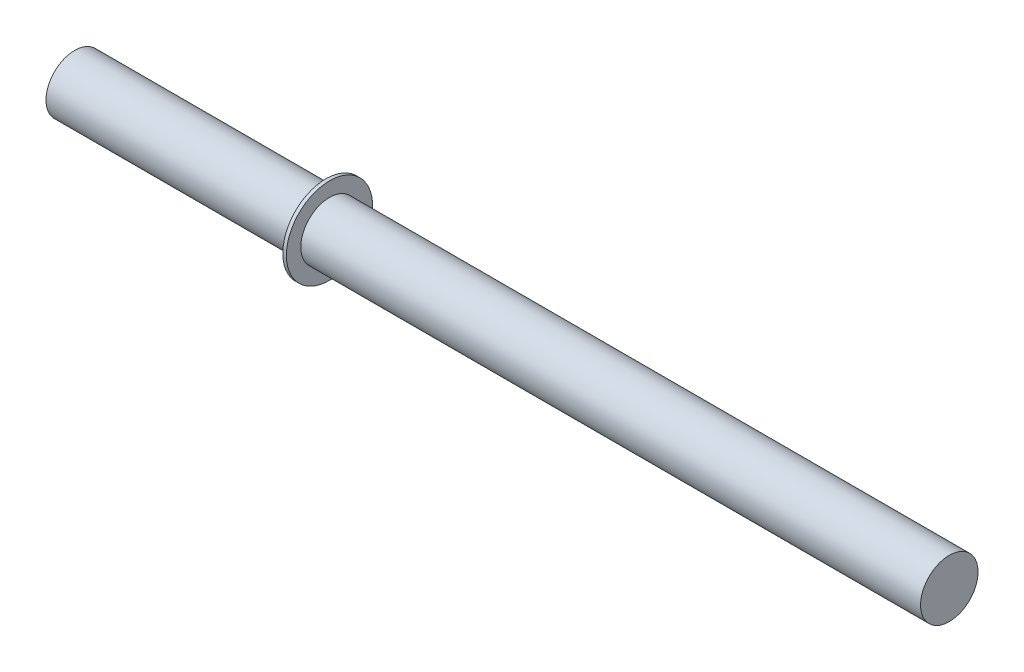
ISO-10303-21;
HEADER;
FILE_DESCRIPTION(('STEP AP214'),'2;1');
FILE_NAME('part.step','',(''),(''),'','','');
FILE_SCHEMA(('AUTOMOTIVE_DESIGN { 1 0 10303 214 1 1 1 1 }'));
ENDSEC;
DATA;
#1=APPLICATION_CONTEXT('core data for automotive mechanical design processes');
#2=APPLICATION_PROTOCOL_DEFINITION('international standard','automotive_design',2000,#1);
#3=PRODUCT_CONTEXT('',#1,'mechanical');
#4=PRODUCT('Part','Part','',(#3));
#5=PRODUCT_RELATED_PRODUCT_CATEGORY('part','',(#4));
#6=PRODUCT_DEFINITION_FORMATION('','',#4);
#7=PRODUCT_DEFINITION_CONTEXT('part definition',#1,'design');
#8=PRODUCT_DEFINITION('design','',#6,#7);
#9=PRODUCT_DEFINITION_SHAPE('','',#8);
#10=(LENGTH_UNIT() NAMED_UNIT(*) SI_UNIT(.MILLI.,.METRE.));
#11=(NAMED_UNIT(*) PLANE_ANGLE_UNIT() SI_UNIT($,.RADIAN.));
#12=(NAMED_UNIT(*) SI_UNIT($,.STERADIAN.) SOLID_ANGLE_UNIT());
#13=UNCERTAINTY_MEASURE_WITH_UNIT(LENGTH_MEASURE(1.E-05),#10,'distance_accuracy_value','');
#14=(GEOMETRIC_REPRESENTATION_CONTEXT(3) GLOBAL_UNCERTAINTY_ASSIGNED_CONTEXT((#13)) GLOBAL_UNIT_ASSIGNED_CONTEXT((#10,
#11,#12)) REPRESENTATION_CONTEXT('',''));
#15=CARTESIAN_POINT('',(0.,0.,0.));
#16=DIRECTION('',(0.,0.,1.));
#17=DIRECTION('',(1.,0.,0.));
#18=AXIS2_PLACEMENT_3D('',#15,#16,#17);
#19=CARTESIAN_POINT('',(-60.85,0.,0.));
#20=DIRECTION('',(-1.,0.,0.));
#21=DIRECTION('',(0.,0.,1.));
#22=AXIS2_PLACEMENT_3D('',#19,#20,#21);
#23=CYLINDRICAL_SURFACE('',#22,4.);
#24=CARTESIAN_POINT('',(-25.4,0.,0.));
#25=DIRECTION('',(1.,0.,0.));
#26=DIRECTION('',(0.,0.,-1.));
#27=AXIS2_PLACEMENT_3D('',#24,#25,#26);
#28=CIRCLE('',#27,4.);
#29=CARTESIAN_POINT('',(-25.4,0.,-4.));
#30=VERTEX_POINT('',#29);
#31=EDGE_CURVE('E10',#30,#30,#28,.F.);
#32=ORIENTED_EDGE('',*,*,#31,.F.);
#33=EDGE_LOOP('',(#32));
#34=FACE_BOUND('',#33,.T.);
#35=CARTESIAN_POINT('',(60.85,0.,0.));
#36=DIRECTION('',(-1.,0.,0.));
#37=DIRECTION('',(0.,0.,1.));
#38=AXIS2_PLACEMENT_3D('',#35,#36,#37);
#39=CIRCLE('',#38,4.);
#40=CARTESIAN_POINT('',(60.85,0.,4.));
#41=VERTEX_POINT('',#40);
#42=EDGE_CURVE('E45',#41,#41,#39,.T.);
#43=ORIENTED_EDGE('',*,*,#42,.T.);
#44=EDGE_LOOP('',(#43));
#45=FACE_BOUND('',#44,.T.);
#46=ADVANCED_FACE('F30',(#34,#45),#23,.T.);
#47=CARTESIAN_POINT('',(60.85,0.,0.));
#48=DIRECTION('',(1.,0.,0.));
#49=DIRECTION('',(0.,0.,-1.));
#50=AXIS2_PLACEMENT_3D('',#47,#48,#49);
#51=PLANE('',#50);
#52=ORIENTED_EDGE('',*,*,#42,.F.);
#53=EDGE_LOOP('',(#52));
#54=FACE_BOUND('',#53,.T.);
#55=ADVANCED_FACE('F69',(#54),#51,.T.);
#56=CARTESIAN_POINT('',(-25.4,0.,0.));
#57=DIRECTION('',(1.,0.,0.));
#58=DIRECTION('',(0.,0.,-1.));
#59=AXIS2_PLACEMENT_3D('',#56,#57,#58);
#60=PLANE('',#59);
#61=ORIENTED_EDGE('',*,*,#31,.T.);
#62=EDGE_LOOP('',(#61));
#63=FACE_BOUND('',#62,.T.);
#64=CARTESIAN_POINT('',(-25.4,0.,0.));
#65=DIRECTION('',(-1.,0.,0.));
#66=DIRECTION('',(0.,0.,1.));
#67=AXIS2_PLACEMENT_3D('',#64,#65,#66);
#68=CIRCLE('',#67,6.);
#69=CARTESIAN_POINT('',(-25.4,0.,6.));
#70=VERTEX_POINT('',#69);
#71=EDGE_CURVE('E50',#70,#70,#68,.T.);
#72=ORIENTED_EDGE('',*,*,#71,.F.);
#73=EDGE_LOOP('',(#72));
#74=FACE_BOUND('',#73,.T.);
#75=ADVANCED_FACE('F61',(#63,#74),#60,.T.);
#76=CARTESIAN_POINT('',(-25.9,0.,0.));
#77=DIRECTION('',(-1.,0.,0.));
#78=DIRECTION('',(0.,0.,1.));
#79=AXIS2_PLACEMENT_3D('',#76,#77,#78);
#80=CYLINDRICAL_SURFACE('',#79,6.);
#81=ORIENTED_EDGE('',*,*,#71,.T.);
#82=EDGE_LOOP('',(#81));
#83=FACE_BOUND('',#82,.T.);
#84=CARTESIAN_POINT('',(-25.9,0.,0.));
#85=DIRECTION('',(-1.,0.,0.));
#86=DIRECTION('',(0.,0.,1.));
#87=AXIS2_PLACEMENT_3D('',#84,#85,#86);
#88=CIRCLE('',#87,6.);
#89=CARTESIAN_POINT('',(-25.9,0.,6.));
#90=VERTEX_POINT('',#89);
#91=EDGE_CURVE('E53',#90,#90,#88,.T.);
#92=ORIENTED_EDGE('',*,*,#91,.F.);
#93=EDGE_LOOP('',(#92));
#94=FACE_BOUND('',#93,.T.);
#95=ADVANCED_FACE('F59',(#83,#94),#80,.T.);
#96=CARTESIAN_POINT('',(-25.9,-6.,0.));
#97=DIRECTION('',(-1.,0.,0.));
#98=DIRECTION('',(0.,0.,1.));
#99=AXIS2_PLACEMENT_3D('',#96,#97,#98);
#100=PLANE('',#99);
#101=CARTESIAN_POINT('',(-25.9,0.,0.));
#102=DIRECTION('',(-1.,0.,0.));
#103=DIRECTION('',(0.,0.,1.));
#104=AXIS2_PLACEMENT_3D('',#101,#102,#103);
#105=CIRCLE('',#104,4.);
#106=CARTESIAN_POINT('',(-25.9,0.,4.));
#107=VERTEX_POINT('',#106);
#108=EDGE_CURVE('E37',#107,#107,#105,.F.);
#109=ORIENTED_EDGE('',*,*,#108,.T.);
#110=EDGE_LOOP('',(#109));
#111=FACE_BOUND('',#110,.T.);
#112=ORIENTED_EDGE('',*,*,#91,.T.);
#113=EDGE_LOOP('',(#112));
#114=FACE_BOUND('',#113,.T.);
#115=ADVANCED_FACE('F57',(#111,#114),#100,.T.);
#116=CARTESIAN_POINT('',(-60.85,0.,0.));
#117=DIRECTION('',(-1.,0.,0.));
#118=DIRECTION('',(0.,0.,1.));
#119=AXIS2_PLACEMENT_3D('',#116,#117,#118);
#120=PLANE('',#119);
#121=CARTESIAN_POINT('',(-60.85,0.,0.));
#122=DIRECTION('',(-1.,0.,0.));
#123=DIRECTION('',(0.,0.,1.));
#124=AXIS2_PLACEMENT_3D('',#121,#122,#123);
#125=CIRCLE('',#124,4.);
#126=CARTESIAN_POINT('',(-60.85,0.,4.));
#127=VERTEX_POINT('',#126);
#128=EDGE_CURVE('E41',#127,#127,#125,.T.);
#129=ORIENTED_EDGE('',*,*,#128,.T.);
#130=EDGE_LOOP('',(#129));
#131=FACE_BOUND('',#130,.T.);
#132=ADVANCED_FACE('F32',(#131),#120,.T.);
#133=ORIENTED_EDGE('',*,*,#108,.F.);
#134=EDGE_LOOP('',(#133));
#135=FACE_BOUND('',#134,.T.);
#136=ORIENTED_EDGE('',*,*,#128,.F.);
#137=EDGE_LOOP('',(#136));
#138=FACE_BOUND('',#137,.T.);
#139=ADVANCED_FACE('F73',(#135,#138),#23,.T.);
#140=CLOSED_SHELL('',(#46,#55,#75,#95,#115,#132,#139));
#141=MANIFOLD_SOLID_BREP('B2',#140);
#142=ADVANCED_BREP_SHAPE_REPRESENTATION('',(#18,#141),#14);
#143=SHAPE_DEFINITION_REPRESENTATION(#9,#142);
ENDSEC;
END-ISO-10303-21;
